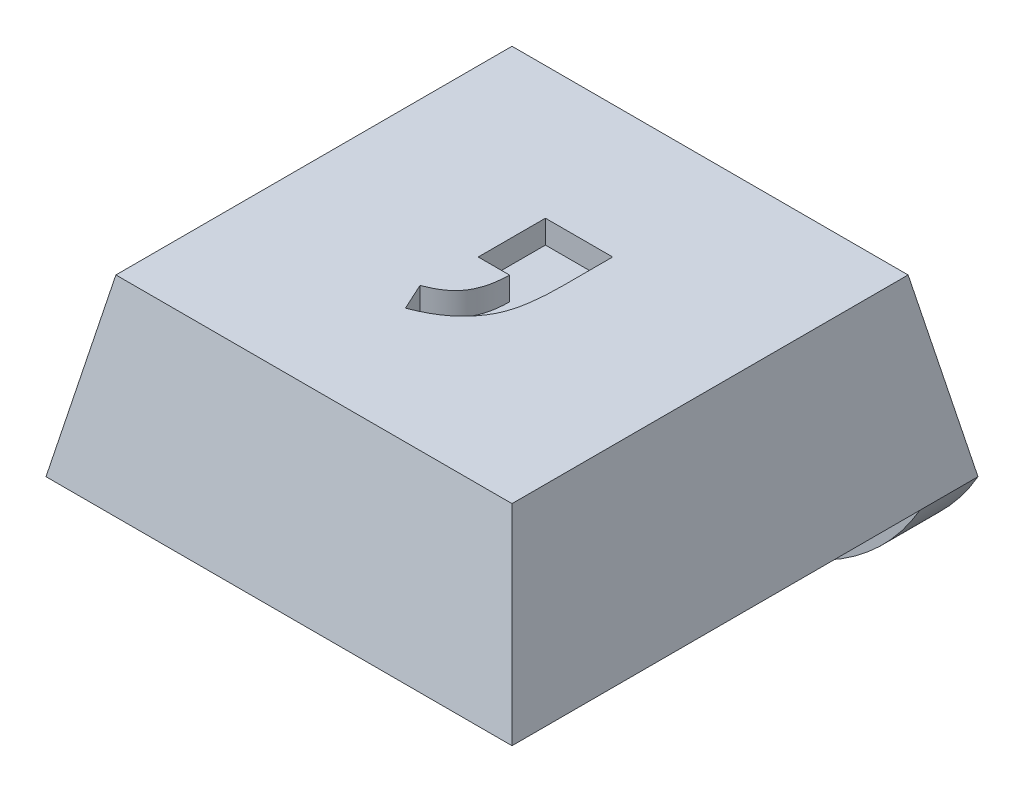
ISO-10303-21;
HEADER;
FILE_DESCRIPTION(('STEP AP214'),'2;1');
FILE_NAME('part.step','',(''),(''),'','','');
FILE_SCHEMA(('AUTOMOTIVE_DESIGN { 1 0 10303 214 1 1 1 1 }'));
ENDSEC;
DATA;
#1=APPLICATION_CONTEXT('core data for automotive mechanical design processes');
#2=APPLICATION_PROTOCOL_DEFINITION('international standard','automotive_design',2000,#1);
#3=PRODUCT_CONTEXT('',#1,'mechanical');
#4=PRODUCT('Part','Part','',(#3));
#5=PRODUCT_RELATED_PRODUCT_CATEGORY('part','',(#4));
#6=PRODUCT_DEFINITION_FORMATION('','',#4);
#7=PRODUCT_DEFINITION_CONTEXT('part definition',#1,'design');
#8=PRODUCT_DEFINITION('design','',#6,#7);
#9=PRODUCT_DEFINITION_SHAPE('','',#8);
#10=(LENGTH_UNIT() NAMED_UNIT(*) SI_UNIT(.MILLI.,.METRE.));
#11=(NAMED_UNIT(*) PLANE_ANGLE_UNIT() SI_UNIT($,.RADIAN.));
#12=(NAMED_UNIT(*) SI_UNIT($,.STERADIAN.) SOLID_ANGLE_UNIT());
#13=UNCERTAINTY_MEASURE_WITH_UNIT(LENGTH_MEASURE(1.E-05),#10,'distance_accuracy_value','');
#14=(GEOMETRIC_REPRESENTATION_CONTEXT(3) GLOBAL_UNCERTAINTY_ASSIGNED_CONTEXT((#13)) GLOBAL_UNIT_ASSIGNED_CONTEXT((#10,
#11,#12)) REPRESENTATION_CONTEXT('',''));
#15=CARTESIAN_POINT('',(0.,0.,0.));
#16=DIRECTION('',(0.,0.,1.));
#17=DIRECTION('',(1.,0.,0.));
#18=AXIS2_PLACEMENT_3D('',#15,#16,#17);
#19=CARTESIAN_POINT('',(0.,3.,0.));
#20=DIRECTION('',(0.,-1.,0.));
#21=DIRECTION('',(0.,0.,-1.));
#22=AXIS2_PLACEMENT_3D('',#19,#20,#21);
#23=PLANE('',#22);
#24=DIRECTION('',(-1.,0.,0.));
#25=VECTOR('',#24,1.);
#26=CARTESIAN_POINT('',(11.,3.,-0.6));
#27=LINE('',#26,#25);
#28=CARTESIAN_POINT('',(7.4,3.,-0.6));
#29=VERTEX_POINT('',#28);
#30=CARTESIAN_POINT('',(0.6,3.,-0.6));
#31=VERTEX_POINT('',#30);
#32=EDGE_CURVE('E199',#29,#31,#27,.T.);
#33=ORIENTED_EDGE('',*,*,#32,.F.);
#34=DIRECTION('',(0.,0.,1.));
#35=VECTOR('',#34,1.);
#36=CARTESIAN_POINT('',(7.4,3.,-8.));
#37=LINE('',#36,#35);
#38=CARTESIAN_POINT('',(7.4,3.,-7.4));
#39=VERTEX_POINT('',#38);
#40=EDGE_CURVE('E212',#39,#29,#37,.T.);
#41=ORIENTED_EDGE('',*,*,#40,.F.);
#42=DIRECTION('',(-1.,0.,0.));
#43=VECTOR('',#42,1.);
#44=CARTESIAN_POINT('',(11.,3.,-7.4));
#45=LINE('',#44,#43);
#46=CARTESIAN_POINT('',(0.599999999999999,3.,-7.4));
#47=VERTEX_POINT('',#46);
#48=EDGE_CURVE('E195',#39,#47,#45,.T.);
#49=ORIENTED_EDGE('',*,*,#48,.T.);
#50=DIRECTION('',(0.,0.,1.));
#51=VECTOR('',#50,1.);
#52=CARTESIAN_POINT('',(0.6,3.,-8.));
#53=LINE('',#52,#51);
#54=EDGE_CURVE('E215',#47,#31,#53,.T.);
#55=ORIENTED_EDGE('',*,*,#54,.T.);
#56=EDGE_LOOP('',(#33,#41,#49,#55));
#57=FACE_BOUND('',#56,.T.);
#58=DIRECTION('',(0.,0.,-1.));
#59=VECTOR('',#58,1.);
#60=CARTESIAN_POINT('',(3.44333189506148,3.,-3.97683988051996));
#61=LINE('',#60,#59);
#62=CARTESIAN_POINT('',(3.44333189506148,3.,-3.97683988051996));
#63=VERTEX_POINT('',#62);
#64=CARTESIAN_POINT('',(3.44333189506148,3.,-5.13068603436611));
#65=VERTEX_POINT('',#64);
#66=EDGE_CURVE('E58',#63,#65,#61,.T.);
#67=ORIENTED_EDGE('',*,*,#66,.T.);
#68=DIRECTION('',(1.,0.,0.));
#69=VECTOR('',#68,1.);
#70=CARTESIAN_POINT('',(3.44333189506148,3.,-5.13068603436611));
#71=LINE('',#70,#69);
#72=CARTESIAN_POINT('',(4.59717804890764,3.,-5.13068603436611));
#73=VERTEX_POINT('',#72);
#74=EDGE_CURVE('E167',#65,#73,#71,.T.);
#75=ORIENTED_EDGE('',*,*,#74,.T.);
#76=DIRECTION('',(0.,0.,1.));
#77=VECTOR('',#76,1.);
#78=CARTESIAN_POINT('',(4.59717804890764,3.,-5.13068603436611));
#79=LINE('',#78,#77);
#80=CARTESIAN_POINT('',(4.59717804890764,3.,-4.2917437266738));
#81=VERTEX_POINT('',#80);
#82=EDGE_CURVE('E568',#73,#81,#79,.T.);
#83=ORIENTED_EDGE('',*,*,#82,.T.);
#84=CARTESIAN_POINT('',(4.59717804890764,3.,-4.2917437266738));
#85=CARTESIAN_POINT('',(4.59664570205697,3.,-4.21117065502821));
#86=CARTESIAN_POINT('',(4.59564056136758,3.,-4.05903812587329));
#87=CARTESIAN_POINT('',(4.57802159676402,3.,-3.84443429493747));
#88=CARTESIAN_POINT('',(4.55354020663032,3.,-3.65597537157936));
#89=CARTESIAN_POINT('',(4.51459394977949,3.,-3.49123894257506));
#90=CARTESIAN_POINT('',(4.46244870361246,3.,-3.34246830222301));
#91=CARTESIAN_POINT('',(4.38872374214653,3.,-3.20633812547181));
#92=CARTESIAN_POINT('',(4.29805614703845,3.,-3.0760663071622));
#93=CARTESIAN_POINT('',(4.18715473139393,3.,-2.95559473776196));
#94=CARTESIAN_POINT('',(4.05957794146906,3.,-2.84417063430685));
#95=CARTESIAN_POINT('',(3.91384748090174,3.,-2.74727533534055));
#96=CARTESIAN_POINT('',(3.75342175566438,3.,-2.66094640759871));
#97=CARTESIAN_POINT('',(3.63816832671193,3.,-2.61549785110123));
#98=CARTESIAN_POINT('',(3.57914920275379,3.,-2.59222449590457));
#99=B_SPLINE_CURVE_WITH_KNOTS('',3,(#84,#85,#86,#87,#88,#89,#90,#91,#92,#93,#94,#95,#96,#97,
#98),.UNSPECIFIED.,.F.,.F.,(4,1,1,1,1,1,1,1,1,1,1,1,4),(0.,0.11226306929848,0.211967401940366,
0.29994169044828,0.376872974033872,0.447529216959618,0.518973247744178,0.591939579442453,
0.668229800220916,0.746606683184938,0.827453118097728,0.911641971053369,1.),.UNSPECIFIED.);
#100=CARTESIAN_POINT('',(3.57914920275379,3.,-2.59222449590457));
#101=VERTEX_POINT('',#100);
#102=EDGE_CURVE('E563',#81,#101,#99,.T.);
#103=ORIENTED_EDGE('',*,*,#102,.T.);
#104=DIRECTION('',(-0.418608195745654,0.,-0.908166933143114));
#105=VECTOR('',#104,1.);
#106=CARTESIAN_POINT('',(3.57914920275379,3.,-2.59222449590457));
#107=LINE('',#106,#105);
#108=CARTESIAN_POINT('',(3.36640881813841,3.,-3.05376295744303));
#109=VERTEX_POINT('',#108);
#110=EDGE_CURVE('E553',#101,#109,#107,.T.);
#111=ORIENTED_EDGE('',*,*,#110,.T.);
#112=CARTESIAN_POINT('',(3.36640881813841,3.,-3.05376295744303));
#113=CARTESIAN_POINT('',(3.41787487419886,3.,-3.0749283403816));
#114=CARTESIAN_POINT('',(3.51608049509068,3.,-3.11531533973616));
#115=CARTESIAN_POINT('',(3.64772184124044,3.,-3.19311523218575));
#116=CARTESIAN_POINT('',(3.75421652325334,3.,-3.28466671684255));
#117=CARTESIAN_POINT('',(3.83984154767036,3.,-3.38842301053576));
#118=CARTESIAN_POINT('',(3.9010592927936,3.,-3.51047208401217));
#119=CARTESIAN_POINT('',(3.94706557535518,3.,-3.64875286186587));
#120=CARTESIAN_POINT('',(3.97373457756071,3.,-3.80680253731697));
#121=CARTESIAN_POINT('',(3.97901655312841,3.,-3.91824926084624));
#122=CARTESIAN_POINT('',(3.98179343352302,3.,-3.97683988051996));
#123=B_SPLINE_CURVE_WITH_KNOTS('',3,(#112,#113,#114,#115,#116,#117,#118,#119,#120,#121,#122),
.UNSPECIFIED.,.F.,.F.,(4,1,1,1,1,1,1,1,4),(0.,0.139244977144443,0.26570210510156,
0.380936804013601,0.489358564032474,0.600190245832484,0.720743413981993,0.853187102279749,1.),.UNSPECIFIED.);
#124=CARTESIAN_POINT('',(3.98179343352302,3.,-3.97683988051996));
#125=VERTEX_POINT('',#124);
#126=EDGE_CURVE('E562',#109,#125,#123,.T.);
#127=ORIENTED_EDGE('',*,*,#126,.T.);
#128=DIRECTION('',(-1.,0.,0.));
#129=VECTOR('',#128,1.);
#130=CARTESIAN_POINT('',(3.98179343352302,3.,-3.97683988051996));
#131=LINE('',#130,#129);
#132=EDGE_CURVE('E163',#125,#63,#131,.T.);
#133=ORIENTED_EDGE('',*,*,#132,.T.);
#134=EDGE_LOOP('',(#67,#75,#83,#103,#111,#127,#133));
#135=FACE_BOUND('',#134,.T.);
#136=ADVANCED_FACE('F42',(#57,#135),#23,.F.);
#137=CARTESIAN_POINT('',(8.,0.,-8.));
#138=DIRECTION('',(-0.98058067569092,-0.196116135138184,0.));
#139=DIRECTION('',(0.196116135138184,-0.98058067569092,0.));
#140=AXIS2_PLACEMENT_3D('',#137,#138,#139);
#141=PLANE('',#140);
#142=DIRECTION('',(-0.192450089729875,0.962250448649376,-0.192450089729875));
#143=VECTOR('',#142,1.);
#144=CARTESIAN_POINT('',(7.7037037037037,1.48148148148148,-0.296296296296296));
#145=LINE('',#144,#143);
#146=CARTESIAN_POINT('',(8.,0.,0.));
#147=VERTEX_POINT('',#146);
#148=EDGE_CURVE('E209',#147,#29,#145,.T.);
#149=ORIENTED_EDGE('',*,*,#148,.F.);
#150=DIRECTION('',(0.,0.,-1.));
#151=VECTOR('',#150,1.);
#152=CARTESIAN_POINT('',(8.,0.,0.));
#153=LINE('',#152,#151);
#154=CARTESIAN_POINT('',(8.,0.,-7.));
#155=VERTEX_POINT('',#154);
#156=EDGE_CURVE('E228',#147,#155,#153,.T.);
#157=ORIENTED_EDGE('',*,*,#156,.T.);
#158=DIRECTION('',(0.,0.,1.));
#159=VECTOR('',#158,1.);
#160=CARTESIAN_POINT('',(8.,0.,-8.));
#161=LINE('',#160,#159);
#162=CARTESIAN_POINT('',(8.,0.,-8.));
#163=VERTEX_POINT('',#162);
#164=EDGE_CURVE('E169',#163,#155,#161,.T.);
#165=ORIENTED_EDGE('',*,*,#164,.F.);
#166=DIRECTION('',(0.192450089729875,-0.962250448649376,-0.192450089729875));
#167=VECTOR('',#166,1.);
#168=CARTESIAN_POINT('',(8.,0.,-8.));
#169=LINE('',#168,#167);
#170=EDGE_CURVE('E202',#39,#163,#169,.T.);
#171=ORIENTED_EDGE('',*,*,#170,.F.);
#172=ORIENTED_EDGE('',*,*,#40,.T.);
#173=EDGE_LOOP('',(#149,#157,#165,#171,#172));
#174=FACE_BOUND('',#173,.T.);
#175=ADVANCED_FACE('F296',(#174),#141,.F.);
#176=CARTESIAN_POINT('',(0.,0.,-8.));
#177=DIRECTION('',(0.98058067569092,-0.196116135138184,0.));
#178=DIRECTION('',(0.196116135138184,0.98058067569092,0.));
#179=AXIS2_PLACEMENT_3D('',#176,#177,#178);
#180=PLANE('',#179);
#181=DIRECTION('',(-0.192450089729875,-0.962250448649376,0.192450089729875));
#182=VECTOR('',#181,1.);
#183=CARTESIAN_POINT('',(0.296296296296296,1.48148148148148,-0.296296296296296));
#184=LINE('',#183,#182);
#185=CARTESIAN_POINT('',(0.,0.,0.));
#186=VERTEX_POINT('',#185);
#187=EDGE_CURVE('E256',#31,#186,#184,.T.);
#188=ORIENTED_EDGE('',*,*,#187,.F.);
#189=ORIENTED_EDGE('',*,*,#54,.F.);
#190=DIRECTION('',(0.192450089729875,0.962250448649376,0.192450089729875));
#191=VECTOR('',#190,1.);
#192=CARTESIAN_POINT('',(0.,0.,-8.));
#193=LINE('',#192,#191);
#194=CARTESIAN_POINT('',(0.,0.,-8.));
#195=VERTEX_POINT('',#194);
#196=EDGE_CURVE('E227',#195,#47,#193,.T.);
#197=ORIENTED_EDGE('',*,*,#196,.F.);
#198=DIRECTION('',(0.,0.,1.));
#199=VECTOR('',#198,1.);
#200=CARTESIAN_POINT('',(0.,0.,0.));
#201=LINE('',#200,#199);
#202=CARTESIAN_POINT('',(0.,0.,-7.));
#203=VERTEX_POINT('',#202);
#204=EDGE_CURVE('E232',#195,#203,#201,.T.);
#205=ORIENTED_EDGE('',*,*,#204,.T.);
#206=EDGE_CURVE('E219',#203,#186,#201,.T.);
#207=ORIENTED_EDGE('',*,*,#206,.T.);
#208=EDGE_LOOP('',(#188,#189,#197,#205,#207));
#209=FACE_BOUND('',#208,.T.);
#210=ADVANCED_FACE('F280',(#209),#180,.F.);
#211=CARTESIAN_POINT('',(0.,0.,0.));
#212=DIRECTION('',(0.,-1.,0.));
#213=DIRECTION('',(0.,0.,-1.));
#214=AXIS2_PLACEMENT_3D('',#211,#212,#213);
#215=PLANE('',#214);
#216=DIRECTION('',(-1.,0.,0.));
#217=VECTOR('',#216,1.);
#218=CARTESIAN_POINT('',(0.,0.,-7.));
#219=LINE('',#218,#217);
#220=EDGE_CURVE('E175',#155,#203,#219,.T.);
#221=ORIENTED_EDGE('',*,*,#220,.F.);
#222=ORIENTED_EDGE('',*,*,#156,.F.);
#223=DIRECTION('',(1.,0.,0.));
#224=VECTOR('',#223,1.);
#225=CARTESIAN_POINT('',(0.,0.,0.));
#226=LINE('',#225,#224);
#227=EDGE_CURVE('E229',#186,#147,#226,.T.);
#228=ORIENTED_EDGE('',*,*,#227,.F.);
#229=ORIENTED_EDGE('',*,*,#206,.F.);
#230=EDGE_LOOP('',(#221,#222,#228,#229));
#231=FACE_BOUND('',#230,.T.);
#232=CARTESIAN_POINT('',(4.,0.,-3.75));
#233=DIRECTION('',(0.,-1.,0.));
#234=DIRECTION('',(0.,0.,-1.));
#235=AXIS2_PLACEMENT_3D('',#232,#233,#234);
#236=CIRCLE('',#235,1.8);
#237=CARTESIAN_POINT('',(4.,0.,-5.55));
#238=VERTEX_POINT('',#237);
#239=EDGE_CURVE('E187',#238,#238,#236,.T.);
#240=ORIENTED_EDGE('',*,*,#239,.F.);
#241=EDGE_LOOP('',(#240));
#242=FACE_BOUND('',#241,.T.);
#243=ADVANCED_FACE('F291',(#231,#242),#215,.T.);
#244=CARTESIAN_POINT('',(11.,3.,-7.4));
#245=DIRECTION('',(0.,0.196116135138184,-0.98058067569092));
#246=DIRECTION('',(0.,0.98058067569092,0.196116135138184));
#247=AXIS2_PLACEMENT_3D('',#244,#245,#246);
#248=PLANE('',#247);
#249=ORIENTED_EDGE('',*,*,#170,.T.);
#250=DIRECTION('',(-1.,0.,0.));
#251=VECTOR('',#250,1.);
#252=CARTESIAN_POINT('',(0.,0.,-8.));
#253=LINE('',#252,#251);
#254=EDGE_CURVE('E223',#163,#195,#253,.T.);
#255=ORIENTED_EDGE('',*,*,#254,.T.);
#256=ORIENTED_EDGE('',*,*,#196,.T.);
#257=ORIENTED_EDGE('',*,*,#48,.F.);
#258=EDGE_LOOP('',(#249,#255,#256,#257));
#259=FACE_BOUND('',#258,.T.);
#260=ADVANCED_FACE('F275',(#259),#248,.T.);
#261=CARTESIAN_POINT('',(11.,0.,0.));
#262=DIRECTION('',(0.,0.196116135138184,0.98058067569092));
#263=DIRECTION('',(0.,-0.98058067569092,0.196116135138184));
#264=AXIS2_PLACEMENT_3D('',#261,#262,#263);
#265=PLANE('',#264);
#266=ORIENTED_EDGE('',*,*,#148,.T.);
#267=ORIENTED_EDGE('',*,*,#32,.T.);
#268=ORIENTED_EDGE('',*,*,#187,.T.);
#269=ORIENTED_EDGE('',*,*,#227,.T.);
#270=EDGE_LOOP('',(#266,#267,#268,#269));
#271=FACE_BOUND('',#270,.T.);
#272=ADVANCED_FACE('F322',(#271),#265,.T.);
#273=CARTESIAN_POINT('',(4.,0.8,-3.75));
#274=DIRECTION('',(0.,-1.,0.));
#275=DIRECTION('',(0.,0.,-1.));
#276=AXIS2_PLACEMENT_3D('',#273,#274,#275);
#277=CYLINDRICAL_SURFACE('',#276,1.8);
#278=CARTESIAN_POINT('',(4.,0.8,-3.75));
#279=DIRECTION('',(0.,-1.,0.));
#280=DIRECTION('',(0.,0.,-1.));
#281=AXIS2_PLACEMENT_3D('',#278,#279,#280);
#282=CIRCLE('',#281,1.8);
#283=CARTESIAN_POINT('',(4.,0.8,-5.55));
#284=VERTEX_POINT('',#283);
#285=EDGE_CURVE('E191',#284,#284,#282,.T.);
#286=ORIENTED_EDGE('',*,*,#285,.F.);
#287=EDGE_LOOP('',(#286));
#288=FACE_BOUND('',#287,.T.);
#289=ORIENTED_EDGE('',*,*,#239,.T.);
#290=EDGE_LOOP('',(#289));
#291=FACE_BOUND('',#290,.T.);
#292=ADVANCED_FACE('F329',(#288,#291),#277,.F.);
#293=CARTESIAN_POINT('',(4.,0.8,-3.75));
#294=DIRECTION('',(0.,-1.,0.));
#295=DIRECTION('',(0.,0.,-1.));
#296=AXIS2_PLACEMENT_3D('',#293,#294,#295);
#297=PLANE('',#296);
#298=ORIENTED_EDGE('',*,*,#285,.T.);
#299=EDGE_LOOP('',(#298));
#300=FACE_BOUND('',#299,.T.);
#301=ADVANCED_FACE('F333',(#300),#297,.T.);
#302=CARTESIAN_POINT('',(0.,-2.,-8.));
#303=DIRECTION('',(0.,0.,1.));
#304=DIRECTION('',(1.,0.,0.));
#305=AXIS2_PLACEMENT_3D('',#302,#303,#304);
#306=PLANE('',#305);
#307=ORIENTED_EDGE('',*,*,#254,.F.);
#308=CARTESIAN_POINT('',(4.53589838486225,2.,-8.));
#309=DIRECTION('',(0.,0.,1.));
#310=DIRECTION('',(1.,0.,0.));
#311=AXIS2_PLACEMENT_3D('',#308,#309,#310);
#312=CIRCLE('',#311,4.);
#313=CARTESIAN_POINT('',(4.53589838486225,-2.,-8.));
#314=VERTEX_POINT('',#313);
#315=EDGE_CURVE('E11',#163,#314,#312,.F.);
#316=ORIENTED_EDGE('',*,*,#315,.T.);
#317=DIRECTION('',(1.,0.,0.));
#318=VECTOR('',#317,1.);
#319=CARTESIAN_POINT('',(0.,-2.,-8.));
#320=LINE('',#319,#318);
#321=CARTESIAN_POINT('',(3.46410161513775,-2.,-8.));
#322=VERTEX_POINT('',#321);
#323=EDGE_CURVE('E181',#322,#314,#320,.T.);
#324=ORIENTED_EDGE('',*,*,#323,.F.);
#325=CARTESIAN_POINT('',(3.46410161513775,2.,-8.));
#326=DIRECTION('',(0.,0.,1.));
#327=DIRECTION('',(1.,0.,0.));
#328=AXIS2_PLACEMENT_3D('',#325,#326,#327);
#329=CIRCLE('',#328,4.);
#330=EDGE_CURVE('E51',#322,#195,#329,.F.);
#331=ORIENTED_EDGE('',*,*,#330,.T.);
#332=EDGE_LOOP('',(#307,#316,#324,#331));
#333=FACE_BOUND('',#332,.T.);
#334=ADVANCED_FACE('F268',(#333),#306,.F.);
#335=CARTESIAN_POINT('',(0.,-2.,-7.));
#336=DIRECTION('',(0.,0.,-1.));
#337=DIRECTION('',(-1.,0.,0.));
#338=AXIS2_PLACEMENT_3D('',#335,#336,#337);
#339=PLANE('',#338);
#340=DIRECTION('',(-1.,0.,0.));
#341=VECTOR('',#340,1.);
#342=CARTESIAN_POINT('',(0.,-2.,-7.));
#343=LINE('',#342,#341);
#344=CARTESIAN_POINT('',(4.53589838486225,-2.,-7.));
#345=VERTEX_POINT('',#344);
#346=CARTESIAN_POINT('',(3.46410161513775,-2.,-7.));
#347=VERTEX_POINT('',#346);
#348=EDGE_CURVE('E185',#345,#347,#343,.T.);
#349=ORIENTED_EDGE('',*,*,#348,.F.);
#350=CARTESIAN_POINT('',(4.53589838486225,2.,-7.));
#351=DIRECTION('',(0.,0.,-1.));
#352=DIRECTION('',(-1.,0.,0.));
#353=AXIS2_PLACEMENT_3D('',#350,#351,#352);
#354=CIRCLE('',#353,4.);
#355=EDGE_CURVE('E262',#345,#155,#354,.F.);
#356=ORIENTED_EDGE('',*,*,#355,.T.);
#357=ORIENTED_EDGE('',*,*,#220,.T.);
#358=CARTESIAN_POINT('',(3.46410161513775,2.,-7.));
#359=DIRECTION('',(0.,0.,-1.));
#360=DIRECTION('',(-1.,0.,0.));
#361=AXIS2_PLACEMENT_3D('',#358,#359,#360);
#362=CIRCLE('',#361,4.);
#363=EDGE_CURVE('E66',#203,#347,#362,.F.);
#364=ORIENTED_EDGE('',*,*,#363,.T.);
#365=EDGE_LOOP('',(#349,#356,#357,#364));
#366=FACE_BOUND('',#365,.T.);
#367=ADVANCED_FACE('F286',(#366),#339,.F.);
#368=CARTESIAN_POINT('',(0.,-2.,0.));
#369=DIRECTION('',(0.,1.,0.));
#370=DIRECTION('',(0.,0.,1.));
#371=AXIS2_PLACEMENT_3D('',#368,#369,#370);
#372=PLANE('',#371);
#373=ORIENTED_EDGE('',*,*,#323,.T.);
#374=DIRECTION('',(0.,0.,1.));
#375=VECTOR('',#374,1.);
#376=CARTESIAN_POINT('',(4.53589838486225,-2.,0.));
#377=LINE('',#376,#375);
#378=EDGE_CURVE('E255',#314,#345,#377,.T.);
#379=ORIENTED_EDGE('',*,*,#378,.T.);
#380=ORIENTED_EDGE('',*,*,#348,.T.);
#381=DIRECTION('',(0.,0.,-1.));
#382=VECTOR('',#381,1.);
#383=CARTESIAN_POINT('',(3.46410161513775,-2.,0.));
#384=LINE('',#383,#382);
#385=EDGE_CURVE('E251',#347,#322,#384,.T.);
#386=ORIENTED_EDGE('',*,*,#385,.T.);
#387=EDGE_LOOP('',(#373,#379,#380,#386));
#388=FACE_BOUND('',#387,.T.);
#389=ADVANCED_FACE('F284',(#388),#372,.F.);
#390=CARTESIAN_POINT('',(4.53589838486225,2.,-8.));
#391=DIRECTION('',(0.,0.,1.));
#392=DIRECTION('',(1.,0.,0.));
#393=AXIS2_PLACEMENT_3D('',#390,#391,#392);
#394=CYLINDRICAL_SURFACE('',#393,4.);
#395=ORIENTED_EDGE('',*,*,#315,.F.);
#396=ORIENTED_EDGE('',*,*,#164,.T.);
#397=ORIENTED_EDGE('',*,*,#355,.F.);
#398=ORIENTED_EDGE('',*,*,#378,.F.);
#399=EDGE_LOOP('',(#395,#396,#397,#398));
#400=FACE_BOUND('',#399,.T.);
#401=ADVANCED_FACE('F297',(#400),#394,.T.);
#402=CARTESIAN_POINT('',(3.46410161513775,2.,-8.));
#403=DIRECTION('',(0.,0.,-1.));
#404=DIRECTION('',(-1.,0.,0.));
#405=AXIS2_PLACEMENT_3D('',#402,#403,#404);
#406=CYLINDRICAL_SURFACE('',#405,4.);
#407=ORIENTED_EDGE('',*,*,#363,.F.);
#408=ORIENTED_EDGE('',*,*,#204,.F.);
#409=ORIENTED_EDGE('',*,*,#330,.F.);
#410=ORIENTED_EDGE('',*,*,#385,.F.);
#411=EDGE_LOOP('',(#407,#408,#409,#410));
#412=FACE_BOUND('',#411,.T.);
#413=ADVANCED_FACE('F44',(#412),#406,.T.);
#414=CARTESIAN_POINT('',(3.44333189506148,2.6,-3.97683988051996));
#415=DIRECTION('',(1.,0.,0.));
#416=DIRECTION('',(0.,0.,-1.));
#417=AXIS2_PLACEMENT_3D('',#414,#415,#416);
#418=PLANE('',#417);
#419=ORIENTED_EDGE('',*,*,#66,.F.);
#420=DIRECTION('',(0.,1.,0.));
#421=VECTOR('',#420,1.);
#422=CARTESIAN_POINT('',(3.44333189506148,2.6,-3.97683988051996));
#423=LINE('',#422,#421);
#424=CARTESIAN_POINT('',(3.44333189506148,2.6,-3.97683988051996));
#425=VERTEX_POINT('',#424);
#426=EDGE_CURVE('E161',#425,#63,#423,.T.);
#427=ORIENTED_EDGE('',*,*,#426,.F.);
#428=DIRECTION('',(0.,0.,-1.));
#429=VECTOR('',#428,1.);
#430=CARTESIAN_POINT('',(3.44333189506148,2.6,-3.97683988051996));
#431=LINE('',#430,#429);
#432=CARTESIAN_POINT('',(3.44333189506148,2.6,-5.13068603436611));
#433=VERTEX_POINT('',#432);
#434=EDGE_CURVE('E151',#425,#433,#431,.T.);
#435=ORIENTED_EDGE('',*,*,#434,.T.);
#436=DIRECTION('',(0.,1.,0.));
#437=VECTOR('',#436,1.);
#438=CARTESIAN_POINT('',(3.44333189506148,2.6,-5.13068603436611));
#439=LINE('',#438,#437);
#440=EDGE_CURVE('E160',#433,#65,#439,.T.);
#441=ORIENTED_EDGE('',*,*,#440,.T.);
#442=EDGE_LOOP('',(#419,#427,#435,#441));
#443=FACE_BOUND('',#442,.T.);
#444=ADVANCED_FACE('F159',(#443),#418,.T.);
#445=CARTESIAN_POINT('',(3.44333189506148,2.6,-5.13068603436611));
#446=DIRECTION('',(0.,0.,1.));
#447=DIRECTION('',(1.,0.,0.));
#448=AXIS2_PLACEMENT_3D('',#445,#446,#447);
#449=PLANE('',#448);
#450=ORIENTED_EDGE('',*,*,#74,.F.);
#451=ORIENTED_EDGE('',*,*,#440,.F.);
#452=DIRECTION('',(1.,0.,0.));
#453=VECTOR('',#452,1.);
#454=CARTESIAN_POINT('',(3.44333189506148,2.6,-5.13068603436611));
#455=LINE('',#454,#453);
#456=CARTESIAN_POINT('',(4.59717804890764,2.6,-5.13068603436611));
#457=VERTEX_POINT('',#456);
#458=EDGE_CURVE('E147',#433,#457,#455,.T.);
#459=ORIENTED_EDGE('',*,*,#458,.T.);
#460=DIRECTION('',(0.,1.,0.));
#461=VECTOR('',#460,1.);
#462=CARTESIAN_POINT('',(4.59717804890764,2.6,-5.13068603436611));
#463=LINE('',#462,#461);
#464=EDGE_CURVE('E170',#457,#73,#463,.T.);
#465=ORIENTED_EDGE('',*,*,#464,.T.);
#466=EDGE_LOOP('',(#450,#451,#459,#465));
#467=FACE_BOUND('',#466,.T.);
#468=ADVANCED_FACE('F165',(#467),#449,.T.);
#469=CARTESIAN_POINT('',(4.59717804890764,2.6,-5.13068603436611));
#470=DIRECTION('',(-1.,0.,0.));
#471=DIRECTION('',(0.,0.,1.));
#472=AXIS2_PLACEMENT_3D('',#469,#470,#471);
#473=PLANE('',#472);
#474=ORIENTED_EDGE('',*,*,#82,.F.);
#475=ORIENTED_EDGE('',*,*,#464,.F.);
#476=DIRECTION('',(0.,0.,1.));
#477=VECTOR('',#476,1.);
#478=CARTESIAN_POINT('',(4.59717804890764,2.6,-5.13068603436611));
#479=LINE('',#478,#477);
#480=CARTESIAN_POINT('',(4.59717804890764,2.6,-4.2917437266738));
#481=VERTEX_POINT('',#480);
#482=EDGE_CURVE('E153',#457,#481,#479,.T.);
#483=ORIENTED_EDGE('',*,*,#482,.T.);
#484=DIRECTION('',(0.,1.,0.));
#485=VECTOR('',#484,1.);
#486=CARTESIAN_POINT('',(4.59717804890764,2.6,-4.2917437266738));
#487=LINE('',#486,#485);
#488=EDGE_CURVE('E177',#481,#81,#487,.T.);
#489=ORIENTED_EDGE('',*,*,#488,.T.);
#490=EDGE_LOOP('',(#474,#475,#483,#489));
#491=FACE_BOUND('',#490,.T.);
#492=ADVANCED_FACE('F346',(#491),#473,.T.);
#493=CARTESIAN_POINT('',(4.59717804890764,2.6,-4.2917437266738));
#494=CARTESIAN_POINT('',(4.59664570205697,2.6,-4.21117065502821));
#495=CARTESIAN_POINT('',(4.59564056136758,2.6,-4.05903812587329));
#496=CARTESIAN_POINT('',(4.57802159676402,2.6,-3.84443429493747));
#497=CARTESIAN_POINT('',(4.55354020663032,2.6,-3.65597537157936));
#498=CARTESIAN_POINT('',(4.51459394977949,2.6,-3.49123894257506));
#499=CARTESIAN_POINT('',(4.46244870361246,2.6,-3.34246830222301));
#500=CARTESIAN_POINT('',(4.38872374214653,2.6,-3.20633812547181));
#501=CARTESIAN_POINT('',(4.29805614703845,2.6,-3.0760663071622));
#502=CARTESIAN_POINT('',(4.18715473139393,2.6,-2.95559473776196));
#503=CARTESIAN_POINT('',(4.05957794146906,2.6,-2.84417063430685));
#504=CARTESIAN_POINT('',(3.91384748090174,2.6,-2.74727533534055));
#505=CARTESIAN_POINT('',(3.75342175566438,2.6,-2.66094640759871));
#506=CARTESIAN_POINT('',(3.63816832671193,2.6,-2.61549785110123));
#507=CARTESIAN_POINT('',(3.57914920275379,2.6,-2.59222449590457));
#508=B_SPLINE_CURVE_WITH_KNOTS('',3,(#493,#494,#495,#496,#497,#498,#499,#500,#501,#502,#503,
#504,#505,#506,#507),.UNSPECIFIED.,.F.,.F.,(4,1,1,1,1,1,1,1,1,1,1,1,4),(0.,0.11226306929848,
0.211967401940366,0.29994169044828,0.376872974033872,0.447529216959618,0.518973247744178,
0.591939579442453,0.668229800220916,0.746606683184938,0.827453118097728,0.911641971053369,1.),.UNSPECIFIED.);
#509=DIRECTION('',(0.,1.,0.));
#510=VECTOR('',#509,1.);
#511=SURFACE_OF_LINEAR_EXTRUSION('',#508,#510);
#512=ORIENTED_EDGE('',*,*,#102,.F.);
#513=ORIENTED_EDGE('',*,*,#488,.F.);
#514=CARTESIAN_POINT('',(3.57914920275379,2.6,-2.59222449590457));
#515=VERTEX_POINT('',#514);
#516=EDGE_CURVE('E357',#481,#515,#508,.T.);
#517=ORIENTED_EDGE('',*,*,#516,.T.);
#518=DIRECTION('',(0.,1.,0.));
#519=VECTOR('',#518,1.);
#520=CARTESIAN_POINT('',(3.57914920275379,2.6,-2.59222449590457));
#521=LINE('',#520,#519);
#522=EDGE_CURVE('E555',#515,#101,#521,.T.);
#523=ORIENTED_EDGE('',*,*,#522,.T.);
#524=EDGE_LOOP('',(#512,#513,#517,#523));
#525=FACE_BOUND('',#524,.T.);
#526=ADVANCED_FACE('F349',(#525),#511,.T.);
#527=CARTESIAN_POINT('',(3.57914920275379,2.6,-2.59222449590457));
#528=DIRECTION('',(0.908166933143113,0.,-0.418608195745654));
#529=DIRECTION('',(-0.418608195745654,0.,-0.908166933143114));
#530=AXIS2_PLACEMENT_3D('',#527,#528,#529);
#531=PLANE('',#530);
#532=ORIENTED_EDGE('',*,*,#110,.F.);
#533=ORIENTED_EDGE('',*,*,#522,.F.);
#534=DIRECTION('',(-0.418608195745654,0.,-0.908166933143114));
#535=VECTOR('',#534,1.);
#536=CARTESIAN_POINT('',(3.57914920275379,2.6,-2.59222449590457));
#537=LINE('',#536,#535);
#538=CARTESIAN_POINT('',(3.36640881813841,2.6,-3.05376295744303));
#539=VERTEX_POINT('',#538);
#540=EDGE_CURVE('E364',#515,#539,#537,.T.);
#541=ORIENTED_EDGE('',*,*,#540,.T.);
#542=DIRECTION('',(0.,1.,0.));
#543=VECTOR('',#542,1.);
#544=CARTESIAN_POINT('',(3.36640881813841,2.6,-3.05376295744303));
#545=LINE('',#544,#543);
#546=EDGE_CURVE('E558',#539,#109,#545,.T.);
#547=ORIENTED_EDGE('',*,*,#546,.T.);
#548=EDGE_LOOP('',(#532,#533,#541,#547));
#549=FACE_BOUND('',#548,.T.);
#550=ADVANCED_FACE('F354',(#549),#531,.T.);
#551=CARTESIAN_POINT('',(3.36640881813841,2.6,-3.05376295744303));
#552=CARTESIAN_POINT('',(3.41787487419886,2.6,-3.0749283403816));
#553=CARTESIAN_POINT('',(3.51608049509068,2.6,-3.11531533973616));
#554=CARTESIAN_POINT('',(3.64772184124044,2.6,-3.19311523218575));
#555=CARTESIAN_POINT('',(3.75421652325334,2.6,-3.28466671684255));
#556=CARTESIAN_POINT('',(3.83984154767036,2.6,-3.38842301053576));
#557=CARTESIAN_POINT('',(3.9010592927936,2.6,-3.51047208401217));
#558=CARTESIAN_POINT('',(3.94706557535518,2.6,-3.64875286186587));
#559=CARTESIAN_POINT('',(3.97373457756071,2.6,-3.80680253731697));
#560=CARTESIAN_POINT('',(3.97901655312841,2.6,-3.91824926084624));
#561=CARTESIAN_POINT('',(3.98179343352302,2.6,-3.97683988051996));
#562=B_SPLINE_CURVE_WITH_KNOTS('',3,(#551,#552,#553,#554,#555,#556,#557,#558,#559,#560,#561),
.UNSPECIFIED.,.F.,.F.,(4,1,1,1,1,1,1,1,4),(0.,0.139244977144443,0.26570210510156,
0.380936804013601,0.489358564032474,0.600190245832484,0.720743413981993,0.853187102279749,1.),.UNSPECIFIED.);
#563=DIRECTION('',(0.,1.,0.));
#564=VECTOR('',#563,1.);
#565=SURFACE_OF_LINEAR_EXTRUSION('',#562,#564);
#566=ORIENTED_EDGE('',*,*,#126,.F.);
#567=ORIENTED_EDGE('',*,*,#546,.F.);
#568=CARTESIAN_POINT('',(3.98179343352302,2.6,-3.97683988051996));
#569=VERTEX_POINT('',#568);
#570=EDGE_CURVE('E370',#539,#569,#562,.T.);
#571=ORIENTED_EDGE('',*,*,#570,.T.);
#572=DIRECTION('',(0.,1.,0.));
#573=VECTOR('',#572,1.);
#574=CARTESIAN_POINT('',(3.98179343352302,2.6,-3.97683988051996));
#575=LINE('',#574,#573);
#576=EDGE_CURVE('E593',#569,#125,#575,.T.);
#577=ORIENTED_EDGE('',*,*,#576,.T.);
#578=EDGE_LOOP('',(#566,#567,#571,#577));
#579=FACE_BOUND('',#578,.T.);
#580=ADVANCED_FACE('F381',(#579),#565,.T.);
#581=CARTESIAN_POINT('',(3.98179343352302,2.6,-3.97683988051996));
#582=DIRECTION('',(0.,0.,-1.));
#583=DIRECTION('',(-1.,0.,0.));
#584=AXIS2_PLACEMENT_3D('',#581,#582,#583);
#585=PLANE('',#584);
#586=ORIENTED_EDGE('',*,*,#132,.F.);
#587=ORIENTED_EDGE('',*,*,#576,.F.);
#588=DIRECTION('',(-1.,0.,0.));
#589=VECTOR('',#588,1.);
#590=CARTESIAN_POINT('',(3.98179343352302,2.6,-3.97683988051996));
#591=LINE('',#590,#589);
#592=EDGE_CURVE('E376',#569,#425,#591,.T.);
#593=ORIENTED_EDGE('',*,*,#592,.T.);
#594=ORIENTED_EDGE('',*,*,#426,.T.);
#595=EDGE_LOOP('',(#586,#587,#593,#594));
#596=FACE_BOUND('',#595,.T.);
#597=ADVANCED_FACE('F384',(#596),#585,.T.);
#598=CARTESIAN_POINT('',(4.40773488743229,2.6,-3.24395907771287));
#599=DIRECTION('',(2.28914748493507E-13,1.,0.));
#600=DIRECTION('',(-1.,2.28914748493507E-13,0.));
#601=AXIS2_PLACEMENT_3D('',#598,#599,#600);
#602=PLANE('',#601);
#603=ORIENTED_EDGE('',*,*,#434,.F.);
#604=ORIENTED_EDGE('',*,*,#592,.F.);
#605=ORIENTED_EDGE('',*,*,#570,.F.);
#606=ORIENTED_EDGE('',*,*,#540,.F.);
#607=ORIENTED_EDGE('',*,*,#516,.F.);
#608=ORIENTED_EDGE('',*,*,#482,.F.);
#609=ORIENTED_EDGE('',*,*,#458,.F.);
#610=EDGE_LOOP('',(#603,#604,#605,#606,#607,#608,#609));
#611=FACE_BOUND('',#610,.T.);
#612=ADVANCED_FACE('F149',(#611),#602,.T.);
#613=CLOSED_SHELL('',(#136,#175,#210,#243,#260,#272,#292,#301,#334,#367,#389,#401,#413,#444,
#468,#492,#526,#550,#580,#597,#612));
#614=MANIFOLD_SOLID_BREP('B2',#613);
#615=ADVANCED_BREP_SHAPE_REPRESENTATION('',(#18,#614),#14);
#616=SHAPE_DEFINITION_REPRESENTATION(#9,#615);
ENDSEC;
END-ISO-10303-21;
